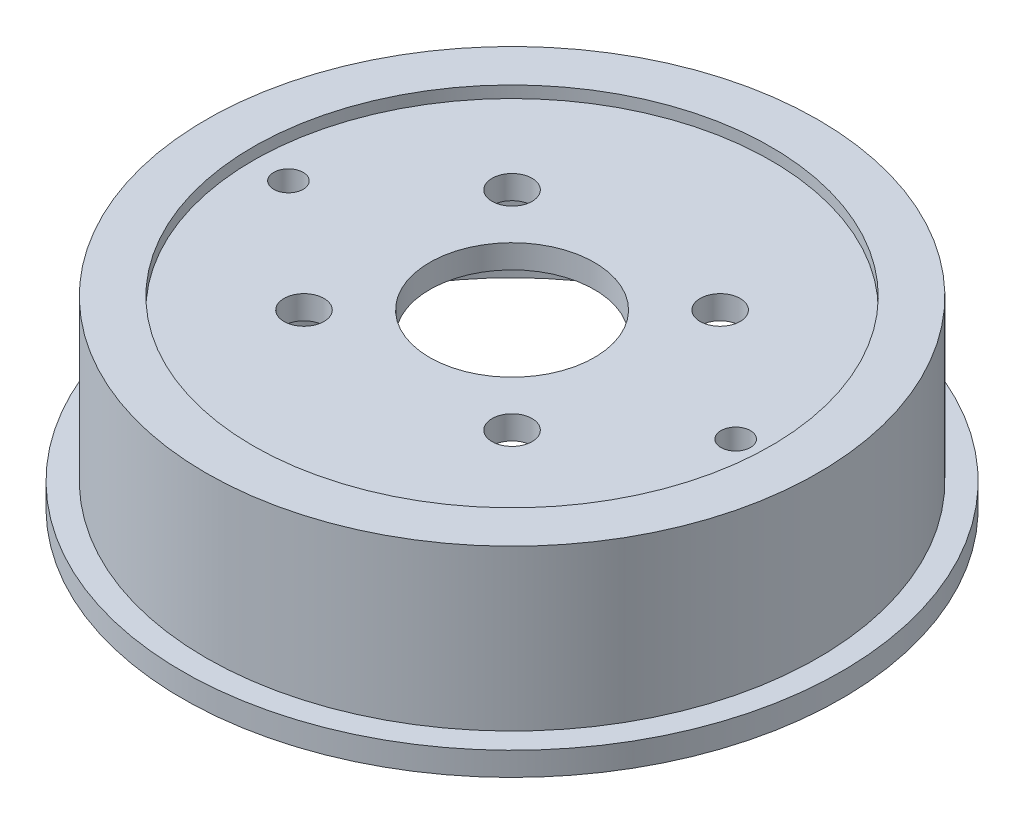
ISO-10303-21;
HEADER;
FILE_DESCRIPTION(('STEP AP214'),'2;1');
FILE_NAME('part.step','',(''),(''),'','','');
FILE_SCHEMA(('AUTOMOTIVE_DESIGN { 1 0 10303 214 1 1 1 1 }'));
ENDSEC;
DATA;
#1=APPLICATION_CONTEXT('core data for automotive mechanical design processes');
#2=APPLICATION_PROTOCOL_DEFINITION('international standard','automotive_design',2000,#1);
#3=PRODUCT_CONTEXT('',#1,'mechanical');
#4=PRODUCT('Part','Part','',(#3));
#5=PRODUCT_RELATED_PRODUCT_CATEGORY('part','',(#4));
#6=PRODUCT_DEFINITION_FORMATION('','',#4);
#7=PRODUCT_DEFINITION_CONTEXT('part definition',#1,'design');
#8=PRODUCT_DEFINITION('design','',#6,#7);
#9=PRODUCT_DEFINITION_SHAPE('','',#8);
#10=(LENGTH_UNIT() NAMED_UNIT(*) SI_UNIT(.MILLI.,.METRE.));
#11=(NAMED_UNIT(*) PLANE_ANGLE_UNIT() SI_UNIT($,.RADIAN.));
#12=(NAMED_UNIT(*) SI_UNIT($,.STERADIAN.) SOLID_ANGLE_UNIT());
#13=UNCERTAINTY_MEASURE_WITH_UNIT(LENGTH_MEASURE(1.E-05),#10,'distance_accuracy_value','');
#14=(GEOMETRIC_REPRESENTATION_CONTEXT(3) GLOBAL_UNCERTAINTY_ASSIGNED_CONTEXT((#13)) GLOBAL_UNIT_ASSIGNED_CONTEXT((#10,
#11,#12)) REPRESENTATION_CONTEXT('',''));
#15=CARTESIAN_POINT('',(0.,0.,0.));
#16=DIRECTION('',(0.,0.,1.));
#17=DIRECTION('',(1.,0.,0.));
#18=AXIS2_PLACEMENT_3D('',#15,#16,#17);
#19=CARTESIAN_POINT('',(0.,12.6,0.));
#20=DIRECTION('',(0.,-1.,0.));
#21=DIRECTION('',(0.,0.,-1.));
#22=AXIS2_PLACEMENT_3D('',#19,#20,#21);
#23=CYLINDRICAL_SURFACE('',#22,24.);
#24=CARTESIAN_POINT('',(0.,0.,0.));
#25=DIRECTION('',(0.,1.,0.));
#26=DIRECTION('',(0.,0.,1.));
#27=AXIS2_PLACEMENT_3D('',#24,#25,#26);
#28=CIRCLE('',#27,24.);
#29=CARTESIAN_POINT('',(0.,0.,24.));
#30=VERTEX_POINT('',#29);
#31=EDGE_CURVE('E173',#30,#30,#28,.T.);
#32=ORIENTED_EDGE('',*,*,#31,.F.);
#33=EDGE_LOOP('',(#32));
#34=FACE_BOUND('',#33,.T.);
#35=CARTESIAN_POINT('',(0.,1.6,0.));
#36=DIRECTION('',(0.,-1.,0.));
#37=DIRECTION('',(0.,0.,-1.));
#38=AXIS2_PLACEMENT_3D('',#35,#36,#37);
#39=CIRCLE('',#38,24.);
#40=CARTESIAN_POINT('',(23.7434201411675,1.6,-3.5));
#41=VERTEX_POINT('',#40);
#42=CARTESIAN_POINT('',(23.7434201411675,1.6,3.5));
#43=VERTEX_POINT('',#42);
#44=EDGE_CURVE('E58',#41,#43,#39,.T.);
#45=ORIENTED_EDGE('',*,*,#44,.F.);
#46=DIRECTION('',(0.,1.,0.));
#47=VECTOR('',#46,1.);
#48=CARTESIAN_POINT('',(23.7434201411675,1.6,-3.5));
#49=LINE('',#48,#47);
#50=CARTESIAN_POINT('',(23.7434201411675,12.6,-3.5));
#51=VERTEX_POINT('',#50);
#52=EDGE_CURVE('E110',#41,#51,#49,.T.);
#53=ORIENTED_EDGE('',*,*,#52,.T.);
#54=CARTESIAN_POINT('',(0.,12.6,0.));
#55=DIRECTION('',(0.,1.,0.));
#56=DIRECTION('',(0.,0.,1.));
#57=AXIS2_PLACEMENT_3D('',#54,#55,#56);
#58=CIRCLE('',#57,24.);
#59=CARTESIAN_POINT('',(-23.7434201411675,12.6,-3.50000000000001));
#60=VERTEX_POINT('',#59);
#61=EDGE_CURVE('E166',#51,#60,#58,.T.);
#62=ORIENTED_EDGE('',*,*,#61,.T.);
#63=DIRECTION('',(0.,1.,0.));
#64=VECTOR('',#63,1.);
#65=CARTESIAN_POINT('',(-23.7434201411675,1.6,-3.5));
#66=LINE('',#65,#64);
#67=CARTESIAN_POINT('',(-23.7434201411675,1.6,-3.5));
#68=VERTEX_POINT('',#67);
#69=EDGE_CURVE('E152',#68,#60,#66,.T.);
#70=ORIENTED_EDGE('',*,*,#69,.F.);
#71=CARTESIAN_POINT('',(0.,1.6,0.));
#72=DIRECTION('',(0.,-1.,0.));
#73=DIRECTION('',(0.,0.,1.));
#74=AXIS2_PLACEMENT_3D('',#71,#72,#73);
#75=CIRCLE('',#74,24.);
#76=CARTESIAN_POINT('',(-23.7434201411675,1.6,3.5));
#77=VERTEX_POINT('',#76);
#78=EDGE_CURVE('E140',#77,#68,#75,.T.);
#79=ORIENTED_EDGE('',*,*,#78,.F.);
#80=DIRECTION('',(0.,1.,0.));
#81=VECTOR('',#80,1.);
#82=CARTESIAN_POINT('',(-23.7434201411675,1.6,3.5));
#83=LINE('',#82,#81);
#84=CARTESIAN_POINT('',(-23.7434201411675,12.6,3.5));
#85=VERTEX_POINT('',#84);
#86=EDGE_CURVE('E155',#77,#85,#83,.T.);
#87=ORIENTED_EDGE('',*,*,#86,.T.);
#88=CARTESIAN_POINT('',(23.7434201411675,12.6,3.50000000000001));
#89=VERTEX_POINT('',#88);
#90=EDGE_CURVE('E167',#85,#89,#58,.T.);
#91=ORIENTED_EDGE('',*,*,#90,.T.);
#92=DIRECTION('',(0.,1.,0.));
#93=VECTOR('',#92,1.);
#94=CARTESIAN_POINT('',(23.7434201411675,1.6,3.5));
#95=LINE('',#94,#93);
#96=EDGE_CURVE('E54',#43,#89,#95,.T.);
#97=ORIENTED_EDGE('',*,*,#96,.F.);
#98=EDGE_LOOP('',(#45,#53,#62,#70,#79,#87,#91,#97));
#99=FACE_BOUND('',#98,.T.);
#100=ADVANCED_FACE('F39',(#34,#99),#23,.F.);
#101=CARTESIAN_POINT('',(0.,12.6,0.));
#102=DIRECTION('',(0.,1.,0.));
#103=DIRECTION('',(0.,0.,1.));
#104=AXIS2_PLACEMENT_3D('',#101,#102,#103);
#105=PLANE('',#104);
#106=CARTESIAN_POINT('',(-8.83883476483184,12.6,-8.83883476483184));
#107=DIRECTION('',(0.,1.,0.));
#108=DIRECTION('',(0.,0.,1.));
#109=AXIS2_PLACEMENT_3D('',#106,#107,#108);
#110=CIRCLE('',#109,1.69999999999999);
#111=CARTESIAN_POINT('',(-8.83883476483184,12.6,-7.13883476483185));
#112=VERTEX_POINT('',#111);
#113=EDGE_CURVE('E412',#112,#112,#110,.T.);
#114=ORIENTED_EDGE('',*,*,#113,.T.);
#115=EDGE_LOOP('',(#114));
#116=FACE_BOUND('',#115,.T.);
#117=CARTESIAN_POINT('',(8.83883476483184,12.6,-8.83883476483184));
#118=DIRECTION('',(0.,1.,0.));
#119=DIRECTION('',(0.,0.,1.));
#120=AXIS2_PLACEMENT_3D('',#117,#118,#119);
#121=CIRCLE('',#120,1.69999999999999);
#122=CARTESIAN_POINT('',(8.83883476483184,12.6,-7.13883476483185));
#123=VERTEX_POINT('',#122);
#124=EDGE_CURVE('E406',#123,#123,#121,.T.);
#125=ORIENTED_EDGE('',*,*,#124,.T.);
#126=EDGE_LOOP('',(#125));
#127=FACE_BOUND('',#126,.T.);
#128=CARTESIAN_POINT('',(8.83883476483185,12.6,8.83883476483184));
#129=DIRECTION('',(0.,1.,0.));
#130=DIRECTION('',(0.,0.,1.));
#131=AXIS2_PLACEMENT_3D('',#128,#129,#130);
#132=CIRCLE('',#131,1.69999999999999);
#133=CARTESIAN_POINT('',(8.83883476483185,12.6,10.5388347648318));
#134=VERTEX_POINT('',#133);
#135=EDGE_CURVE('E400',#134,#134,#132,.T.);
#136=ORIENTED_EDGE('',*,*,#135,.T.);
#137=EDGE_LOOP('',(#136));
#138=FACE_BOUND('',#137,.T.);
#139=CARTESIAN_POINT('',(-8.83883476483184,12.6,8.83883476483184));
#140=DIRECTION('',(0.,1.,0.));
#141=DIRECTION('',(0.,0.,1.));
#142=AXIS2_PLACEMENT_3D('',#139,#140,#141);
#143=CIRCLE('',#142,1.69999999999999);
#144=CARTESIAN_POINT('',(-8.83883476483184,12.6,10.5388347648318));
#145=VERTEX_POINT('',#144);
#146=EDGE_CURVE('E394',#145,#145,#143,.T.);
#147=ORIENTED_EDGE('',*,*,#146,.T.);
#148=EDGE_LOOP('',(#147));
#149=FACE_BOUND('',#148,.T.);
#150=CARTESIAN_POINT('',(0.,12.6,0.));
#151=DIRECTION('',(0.,1.,0.));
#152=DIRECTION('',(0.,0.,1.));
#153=AXIS2_PLACEMENT_3D('',#150,#151,#152);
#154=CIRCLE('',#153,7.);
#155=CARTESIAN_POINT('',(0.,12.6,7.));
#156=VERTEX_POINT('',#155);
#157=EDGE_CURVE('E388',#156,#156,#154,.F.);
#158=ORIENTED_EDGE('',*,*,#157,.F.);
#159=EDGE_LOOP('',(#158));
#160=FACE_BOUND('',#159,.T.);
#161=DIRECTION('',(1.,0.,0.));
#162=VECTOR('',#161,1.);
#163=CARTESIAN_POINT('',(19.,12.6,-3.5));
#164=LINE('',#163,#162);
#165=CARTESIAN_POINT('',(19.,12.6,-3.5));
#166=VERTEX_POINT('',#165);
#167=EDGE_CURVE('E371',#166,#51,#164,.T.);
#168=ORIENTED_EDGE('',*,*,#167,.F.);
#169=CARTESIAN_POINT('',(19.,12.6,0.));
#170=DIRECTION('',(0.,-1.,0.));
#171=DIRECTION('',(0.,0.,-1.));
#172=AXIS2_PLACEMENT_3D('',#169,#170,#171);
#173=CIRCLE('',#172,3.5);
#174=CARTESIAN_POINT('',(19.,12.6,3.5));
#175=VERTEX_POINT('',#174);
#176=EDGE_CURVE('E124',#175,#166,#173,.T.);
#177=ORIENTED_EDGE('',*,*,#176,.F.);
#178=DIRECTION('',(-1.,0.,0.));
#179=VECTOR('',#178,1.);
#180=CARTESIAN_POINT('',(19.,12.6,3.5));
#181=LINE('',#180,#179);
#182=EDGE_CURVE('E121',#89,#175,#181,.T.);
#183=ORIENTED_EDGE('',*,*,#182,.F.);
#184=ORIENTED_EDGE('',*,*,#90,.F.);
#185=DIRECTION('',(-1.,0.,0.));
#186=VECTOR('',#185,1.);
#187=CARTESIAN_POINT('',(-19.,12.6,3.5));
#188=LINE('',#187,#186);
#189=CARTESIAN_POINT('',(-19.,12.6,3.5));
#190=VERTEX_POINT('',#189);
#191=EDGE_CURVE('E128',#190,#85,#188,.T.);
#192=ORIENTED_EDGE('',*,*,#191,.F.);
#193=CARTESIAN_POINT('',(-19.,12.6,0.));
#194=DIRECTION('',(0.,-1.,0.));
#195=DIRECTION('',(0.,0.,1.));
#196=AXIS2_PLACEMENT_3D('',#193,#194,#195);
#197=CIRCLE('',#196,3.5);
#198=CARTESIAN_POINT('',(-19.,12.6,-3.5));
#199=VERTEX_POINT('',#198);
#200=EDGE_CURVE('E125',#199,#190,#197,.T.);
#201=ORIENTED_EDGE('',*,*,#200,.F.);
#202=DIRECTION('',(1.,0.,0.));
#203=VECTOR('',#202,1.);
#204=CARTESIAN_POINT('',(-19.,12.6,-3.5));
#205=LINE('',#204,#203);
#206=EDGE_CURVE('E137',#60,#199,#205,.T.);
#207=ORIENTED_EDGE('',*,*,#206,.F.);
#208=ORIENTED_EDGE('',*,*,#61,.F.);
#209=EDGE_LOOP('',(#168,#177,#183,#184,#192,#201,#207,#208));
#210=FACE_BOUND('',#209,.T.);
#211=ADVANCED_FACE('F186',(#116,#127,#138,#149,#160,#210),#105,.F.);
#212=CARTESIAN_POINT('',(0.,12.6,0.));
#213=DIRECTION('',(0.,-1.,0.));
#214=DIRECTION('',(0.,0.,-1.));
#215=AXIS2_PLACEMENT_3D('',#212,#213,#214);
#216=CYLINDRICAL_SURFACE('',#215,26.);
#217=CARTESIAN_POINT('',(0.,2.,0.));
#218=DIRECTION('',(0.,-1.,0.));
#219=DIRECTION('',(0.,0.,-1.));
#220=AXIS2_PLACEMENT_3D('',#217,#218,#219);
#221=CIRCLE('',#220,26.);
#222=CARTESIAN_POINT('',(0.,2.,-26.));
#223=VERTEX_POINT('',#222);
#224=EDGE_CURVE('E47',#223,#223,#221,.T.);
#225=ORIENTED_EDGE('',*,*,#224,.F.);
#226=EDGE_LOOP('',(#225));
#227=FACE_BOUND('',#226,.T.);
#228=CARTESIAN_POINT('',(0.,15.6,0.));
#229=DIRECTION('',(0.,1.,0.));
#230=DIRECTION('',(0.,0.,1.));
#231=AXIS2_PLACEMENT_3D('',#228,#229,#230);
#232=CIRCLE('',#231,26.);
#233=CARTESIAN_POINT('',(0.,15.6,26.));
#234=VERTEX_POINT('',#233);
#235=EDGE_CURVE('E163',#234,#234,#232,.T.);
#236=ORIENTED_EDGE('',*,*,#235,.F.);
#237=EDGE_LOOP('',(#236));
#238=FACE_BOUND('',#237,.T.);
#239=ADVANCED_FACE('F41',(#227,#238),#216,.T.);
#240=CARTESIAN_POINT('',(0.,0.,0.));
#241=DIRECTION('',(0.,1.,0.));
#242=DIRECTION('',(0.,0.,1.));
#243=AXIS2_PLACEMENT_3D('',#240,#241,#242);
#244=PLANE('',#243);
#245=ORIENTED_EDGE('',*,*,#31,.T.);
#246=EDGE_LOOP('',(#245));
#247=FACE_BOUND('',#246,.T.);
#248=CARTESIAN_POINT('',(0.,0.,0.));
#249=DIRECTION('',(0.,-1.,0.));
#250=DIRECTION('',(0.,0.,-1.));
#251=AXIS2_PLACEMENT_3D('',#248,#249,#250);
#252=CIRCLE('',#251,28.);
#253=CARTESIAN_POINT('',(0.,0.,-28.));
#254=VERTEX_POINT('',#253);
#255=EDGE_CURVE('E169',#254,#254,#252,.T.);
#256=ORIENTED_EDGE('',*,*,#255,.T.);
#257=EDGE_LOOP('',(#256));
#258=FACE_BOUND('',#257,.T.);
#259=ADVANCED_FACE('F185',(#247,#258),#244,.F.);
#260=CARTESIAN_POINT('',(0.,2.,0.));
#261=DIRECTION('',(0.,-1.,0.));
#262=DIRECTION('',(0.,0.,-1.));
#263=AXIS2_PLACEMENT_3D('',#260,#261,#262);
#264=CYLINDRICAL_SURFACE('',#263,28.);
#265=CARTESIAN_POINT('',(0.,2.,0.));
#266=DIRECTION('',(0.,-1.,0.));
#267=DIRECTION('',(0.,0.,-1.));
#268=AXIS2_PLACEMENT_3D('',#265,#266,#267);
#269=CIRCLE('',#268,28.);
#270=CARTESIAN_POINT('',(0.,2.,-28.));
#271=VERTEX_POINT('',#270);
#272=EDGE_CURVE('E170',#271,#271,#269,.T.);
#273=ORIENTED_EDGE('',*,*,#272,.T.);
#274=EDGE_LOOP('',(#273));
#275=FACE_BOUND('',#274,.T.);
#276=ORIENTED_EDGE('',*,*,#255,.F.);
#277=EDGE_LOOP('',(#276));
#278=FACE_BOUND('',#277,.T.);
#279=ADVANCED_FACE('F226',(#275,#278),#264,.T.);
#280=CARTESIAN_POINT('',(0.,2.,0.));
#281=DIRECTION('',(0.,-1.,0.));
#282=DIRECTION('',(0.,0.,-1.));
#283=AXIS2_PLACEMENT_3D('',#280,#281,#282);
#284=PLANE('',#283);
#285=ORIENTED_EDGE('',*,*,#224,.T.);
#286=EDGE_LOOP('',(#285));
#287=FACE_BOUND('',#286,.T.);
#288=ORIENTED_EDGE('',*,*,#272,.F.);
#289=EDGE_LOOP('',(#288));
#290=FACE_BOUND('',#289,.T.);
#291=ADVANCED_FACE('F180',(#287,#290),#284,.F.);
#292=CARTESIAN_POINT('',(0.,15.6,0.));
#293=DIRECTION('',(0.,1.,0.));
#294=DIRECTION('',(0.,0.,1.));
#295=AXIS2_PLACEMENT_3D('',#292,#293,#294);
#296=PLANE('',#295);
#297=ORIENTED_EDGE('',*,*,#235,.T.);
#298=EDGE_LOOP('',(#297));
#299=FACE_BOUND('',#298,.T.);
#300=CARTESIAN_POINT('',(0.,15.6,0.));
#301=DIRECTION('',(0.,1.,0.));
#302=DIRECTION('',(0.,0.,1.));
#303=AXIS2_PLACEMENT_3D('',#300,#301,#302);
#304=CIRCLE('',#303,22.);
#305=CARTESIAN_POINT('',(0.,15.6,22.));
#306=VERTEX_POINT('',#305);
#307=EDGE_CURVE('E160',#306,#306,#304,.T.);
#308=ORIENTED_EDGE('',*,*,#307,.F.);
#309=EDGE_LOOP('',(#308));
#310=FACE_BOUND('',#309,.T.);
#311=ADVANCED_FACE('F189',(#299,#310),#296,.T.);
#312=CARTESIAN_POINT('',(0.,15.6,0.));
#313=DIRECTION('',(0.,-1.,0.));
#314=DIRECTION('',(0.,0.,-1.));
#315=AXIS2_PLACEMENT_3D('',#312,#313,#314);
#316=CYLINDRICAL_SURFACE('',#315,22.);
#317=ORIENTED_EDGE('',*,*,#307,.T.);
#318=EDGE_LOOP('',(#317));
#319=FACE_BOUND('',#318,.T.);
#320=CARTESIAN_POINT('',(0.,14.6,0.));
#321=DIRECTION('',(0.,1.,0.));
#322=DIRECTION('',(0.,0.,1.));
#323=AXIS2_PLACEMENT_3D('',#320,#321,#322);
#324=CIRCLE('',#323,22.);
#325=CARTESIAN_POINT('',(0.,14.6,22.));
#326=VERTEX_POINT('',#325);
#327=EDGE_CURVE('E11',#326,#326,#324,.F.);
#328=ORIENTED_EDGE('',*,*,#327,.T.);
#329=EDGE_LOOP('',(#328));
#330=FACE_BOUND('',#329,.T.);
#331=ADVANCED_FACE('F192',(#319,#330),#316,.F.);
#332=CARTESIAN_POINT('',(0.,14.6,0.));
#333=DIRECTION('',(0.,1.,0.));
#334=DIRECTION('',(0.,0.,1.));
#335=AXIS2_PLACEMENT_3D('',#332,#333,#334);
#336=PLANE('',#335);
#337=CARTESIAN_POINT('',(-8.83883476483184,14.6,-8.83883476483184));
#338=DIRECTION('',(0.,1.,0.));
#339=DIRECTION('',(0.,0.,1.));
#340=AXIS2_PLACEMENT_3D('',#337,#338,#339);
#341=CIRCLE('',#340,1.69999999999999);
#342=CARTESIAN_POINT('',(-8.83883476483184,14.6,-7.13883476483185));
#343=VERTEX_POINT('',#342);
#344=EDGE_CURVE('E415',#343,#343,#341,.T.);
#345=ORIENTED_EDGE('',*,*,#344,.F.);
#346=EDGE_LOOP('',(#345));
#347=FACE_BOUND('',#346,.T.);
#348=CARTESIAN_POINT('',(8.83883476483184,14.6,-8.83883476483184));
#349=DIRECTION('',(0.,1.,0.));
#350=DIRECTION('',(0.,0.,1.));
#351=AXIS2_PLACEMENT_3D('',#348,#349,#350);
#352=CIRCLE('',#351,1.69999999999999);
#353=CARTESIAN_POINT('',(8.83883476483184,14.6,-7.13883476483186));
#354=VERTEX_POINT('',#353);
#355=EDGE_CURVE('E409',#354,#354,#352,.T.);
#356=ORIENTED_EDGE('',*,*,#355,.F.);
#357=EDGE_LOOP('',(#356));
#358=FACE_BOUND('',#357,.T.);
#359=CARTESIAN_POINT('',(8.83883476483185,14.6,8.83883476483184));
#360=DIRECTION('',(0.,1.,0.));
#361=DIRECTION('',(0.,0.,1.));
#362=AXIS2_PLACEMENT_3D('',#359,#360,#361);
#363=CIRCLE('',#362,1.69999999999999);
#364=CARTESIAN_POINT('',(8.83883476483185,14.6,10.5388347648318));
#365=VERTEX_POINT('',#364);
#366=EDGE_CURVE('E403',#365,#365,#363,.T.);
#367=ORIENTED_EDGE('',*,*,#366,.F.);
#368=EDGE_LOOP('',(#367));
#369=FACE_BOUND('',#368,.T.);
#370=CARTESIAN_POINT('',(-8.83883476483184,14.6,8.83883476483184));
#371=DIRECTION('',(0.,1.,0.));
#372=DIRECTION('',(0.,0.,1.));
#373=AXIS2_PLACEMENT_3D('',#370,#371,#372);
#374=CIRCLE('',#373,1.69999999999999);
#375=CARTESIAN_POINT('',(-8.83883476483184,14.6,10.5388347648318));
#376=VERTEX_POINT('',#375);
#377=EDGE_CURVE('E397',#376,#376,#374,.T.);
#378=ORIENTED_EDGE('',*,*,#377,.F.);
#379=EDGE_LOOP('',(#378));
#380=FACE_BOUND('',#379,.T.);
#381=CARTESIAN_POINT('',(0.,14.6,0.));
#382=DIRECTION('',(0.,1.,0.));
#383=DIRECTION('',(0.,0.,1.));
#384=AXIS2_PLACEMENT_3D('',#381,#382,#383);
#385=CIRCLE('',#384,7.);
#386=CARTESIAN_POINT('',(0.,14.6,7.));
#387=VERTEX_POINT('',#386);
#388=EDGE_CURVE('E391',#387,#387,#385,.T.);
#389=ORIENTED_EDGE('',*,*,#388,.F.);
#390=EDGE_LOOP('',(#389));
#391=FACE_BOUND('',#390,.T.);
#392=CARTESIAN_POINT('',(19.,14.6,0.));
#393=DIRECTION('',(0.,1.,0.));
#394=DIRECTION('',(0.,0.,1.));
#395=AXIS2_PLACEMENT_3D('',#392,#393,#394);
#396=CIRCLE('',#395,1.24999999999999);
#397=CARTESIAN_POINT('',(19.,14.6,1.24999999999999));
#398=VERTEX_POINT('',#397);
#399=EDGE_CURVE('E382',#398,#398,#396,.T.);
#400=ORIENTED_EDGE('',*,*,#399,.F.);
#401=EDGE_LOOP('',(#400));
#402=FACE_BOUND('',#401,.T.);
#403=CARTESIAN_POINT('',(-19.,14.6,0.));
#404=DIRECTION('',(0.,1.,0.));
#405=DIRECTION('',(0.,0.,1.));
#406=AXIS2_PLACEMENT_3D('',#403,#404,#405);
#407=CIRCLE('',#406,1.24999999999999);
#408=CARTESIAN_POINT('',(-19.,14.6,1.24999999999999));
#409=VERTEX_POINT('',#408);
#410=EDGE_CURVE('E374',#409,#409,#407,.T.);
#411=ORIENTED_EDGE('',*,*,#410,.F.);
#412=EDGE_LOOP('',(#411));
#413=FACE_BOUND('',#412,.T.);
#414=ORIENTED_EDGE('',*,*,#327,.F.);
#415=EDGE_LOOP('',(#414));
#416=FACE_BOUND('',#415,.T.);
#417=ADVANCED_FACE('F198',(#347,#358,#369,#380,#391,#402,#413,#416),#336,.T.);
#418=CARTESIAN_POINT('',(-19.,1.6,0.));
#419=DIRECTION('',(0.,1.,0.));
#420=DIRECTION('',(0.,0.,1.));
#421=AXIS2_PLACEMENT_3D('',#418,#419,#420);
#422=CYLINDRICAL_SURFACE('',#421,3.5);
#423=ORIENTED_EDGE('',*,*,#200,.T.);
#424=DIRECTION('',(0.,1.,0.));
#425=VECTOR('',#424,1.);
#426=CARTESIAN_POINT('',(-19.,1.6,3.5));
#427=LINE('',#426,#425);
#428=CARTESIAN_POINT('',(-19.,1.6,3.5));
#429=VERTEX_POINT('',#428);
#430=EDGE_CURVE('E157',#429,#190,#427,.T.);
#431=ORIENTED_EDGE('',*,*,#430,.F.);
#432=CARTESIAN_POINT('',(-19.,1.6,0.));
#433=DIRECTION('',(0.,-1.,0.));
#434=DIRECTION('',(0.,0.,1.));
#435=AXIS2_PLACEMENT_3D('',#432,#433,#434);
#436=CIRCLE('',#435,3.5);
#437=CARTESIAN_POINT('',(-19.,1.6,-3.5));
#438=VERTEX_POINT('',#437);
#439=EDGE_CURVE('E133',#438,#429,#436,.T.);
#440=ORIENTED_EDGE('',*,*,#439,.F.);
#441=DIRECTION('',(0.,1.,0.));
#442=VECTOR('',#441,1.);
#443=CARTESIAN_POINT('',(-19.,1.6,-3.5));
#444=LINE('',#443,#442);
#445=EDGE_CURVE('E144',#438,#199,#444,.T.);
#446=ORIENTED_EDGE('',*,*,#445,.T.);
#447=EDGE_LOOP('',(#423,#431,#440,#446));
#448=FACE_BOUND('',#447,.T.);
#449=ADVANCED_FACE('F203',(#448),#422,.T.);
#450=CARTESIAN_POINT('',(-19.,1.6,3.5));
#451=DIRECTION('',(0.,0.,-1.));
#452=DIRECTION('',(-1.,0.,0.));
#453=AXIS2_PLACEMENT_3D('',#450,#451,#452);
#454=PLANE('',#453);
#455=ORIENTED_EDGE('',*,*,#191,.T.);
#456=ORIENTED_EDGE('',*,*,#86,.F.);
#457=DIRECTION('',(-1.,0.,0.));
#458=VECTOR('',#457,1.);
#459=CARTESIAN_POINT('',(-19.,1.6,3.5));
#460=LINE('',#459,#458);
#461=EDGE_CURVE('E136',#429,#77,#460,.T.);
#462=ORIENTED_EDGE('',*,*,#461,.F.);
#463=ORIENTED_EDGE('',*,*,#430,.T.);
#464=EDGE_LOOP('',(#455,#456,#462,#463));
#465=FACE_BOUND('',#464,.T.);
#466=ADVANCED_FACE('F209',(#465),#454,.F.);
#467=CARTESIAN_POINT('',(-19.,1.6,-3.5));
#468=DIRECTION('',(0.,0.,1.));
#469=DIRECTION('',(1.,0.,0.));
#470=AXIS2_PLACEMENT_3D('',#467,#468,#469);
#471=PLANE('',#470);
#472=ORIENTED_EDGE('',*,*,#206,.T.);
#473=ORIENTED_EDGE('',*,*,#445,.F.);
#474=DIRECTION('',(1.,0.,0.));
#475=VECTOR('',#474,1.);
#476=CARTESIAN_POINT('',(-19.,1.6,-3.5));
#477=LINE('',#476,#475);
#478=EDGE_CURVE('E143',#68,#438,#477,.T.);
#479=ORIENTED_EDGE('',*,*,#478,.F.);
#480=ORIENTED_EDGE('',*,*,#69,.T.);
#481=EDGE_LOOP('',(#472,#473,#479,#480));
#482=FACE_BOUND('',#481,.T.);
#483=ADVANCED_FACE('F352',(#482),#471,.F.);
#484=CARTESIAN_POINT('',(-19.,1.6,0.));
#485=DIRECTION('',(0.,1.,0.));
#486=DIRECTION('',(0.,0.,1.));
#487=AXIS2_PLACEMENT_3D('',#484,#485,#486);
#488=PLANE('',#487);
#489=CARTESIAN_POINT('',(-19.,1.6,0.));
#490=DIRECTION('',(0.,-1.,0.));
#491=DIRECTION('',(0.,0.,-1.));
#492=AXIS2_PLACEMENT_3D('',#489,#490,#491);
#493=CIRCLE('',#492,1.24999999999999);
#494=CARTESIAN_POINT('',(-19.,1.6,-1.24999999999999));
#495=VERTEX_POINT('',#494);
#496=EDGE_CURVE('E379',#495,#495,#493,.T.);
#497=ORIENTED_EDGE('',*,*,#496,.F.);
#498=EDGE_LOOP('',(#497));
#499=FACE_BOUND('',#498,.T.);
#500=ORIENTED_EDGE('',*,*,#439,.T.);
#501=ORIENTED_EDGE('',*,*,#461,.T.);
#502=ORIENTED_EDGE('',*,*,#78,.T.);
#503=ORIENTED_EDGE('',*,*,#478,.T.);
#504=EDGE_LOOP('',(#500,#501,#502,#503));
#505=FACE_BOUND('',#504,.T.);
#506=ADVANCED_FACE('F349',(#499,#505),#488,.F.);
#507=CARTESIAN_POINT('',(19.,1.6,0.));
#508=DIRECTION('',(0.,1.,0.));
#509=DIRECTION('',(0.,0.,1.));
#510=AXIS2_PLACEMENT_3D('',#507,#508,#509);
#511=CYLINDRICAL_SURFACE('',#510,3.5);
#512=ORIENTED_EDGE('',*,*,#176,.T.);
#513=DIRECTION('',(0.,1.,0.));
#514=VECTOR('',#513,1.);
#515=CARTESIAN_POINT('',(19.,1.6,-3.5));
#516=LINE('',#515,#514);
#517=CARTESIAN_POINT('',(19.,1.6,-3.5));
#518=VERTEX_POINT('',#517);
#519=EDGE_CURVE('E108',#518,#166,#516,.T.);
#520=ORIENTED_EDGE('',*,*,#519,.F.);
#521=CARTESIAN_POINT('',(19.,1.6,0.));
#522=DIRECTION('',(0.,-1.,0.));
#523=DIRECTION('',(0.,0.,-1.));
#524=AXIS2_PLACEMENT_3D('',#521,#522,#523);
#525=CIRCLE('',#524,3.5);
#526=CARTESIAN_POINT('',(19.,1.6,3.5));
#527=VERTEX_POINT('',#526);
#528=EDGE_CURVE('E112',#527,#518,#525,.T.);
#529=ORIENTED_EDGE('',*,*,#528,.F.);
#530=DIRECTION('',(0.,1.,0.));
#531=VECTOR('',#530,1.);
#532=CARTESIAN_POINT('',(19.,1.6,3.5));
#533=LINE('',#532,#531);
#534=EDGE_CURVE('E367',#527,#175,#533,.T.);
#535=ORIENTED_EDGE('',*,*,#534,.T.);
#536=EDGE_LOOP('',(#512,#520,#529,#535));
#537=FACE_BOUND('',#536,.T.);
#538=ADVANCED_FACE('F123',(#537),#511,.T.);
#539=CARTESIAN_POINT('',(19.,1.6,-3.5));
#540=DIRECTION('',(0.,0.,1.));
#541=DIRECTION('',(1.,0.,0.));
#542=AXIS2_PLACEMENT_3D('',#539,#540,#541);
#543=PLANE('',#542);
#544=ORIENTED_EDGE('',*,*,#167,.T.);
#545=ORIENTED_EDGE('',*,*,#52,.F.);
#546=DIRECTION('',(1.,0.,0.));
#547=VECTOR('',#546,1.);
#548=CARTESIAN_POINT('',(19.,1.6,-3.5));
#549=LINE('',#548,#547);
#550=EDGE_CURVE('E103',#518,#41,#549,.T.);
#551=ORIENTED_EDGE('',*,*,#550,.F.);
#552=ORIENTED_EDGE('',*,*,#519,.T.);
#553=EDGE_LOOP('',(#544,#545,#551,#552));
#554=FACE_BOUND('',#553,.T.);
#555=ADVANCED_FACE('F106',(#554),#543,.F.);
#556=CARTESIAN_POINT('',(19.,1.6,3.5));
#557=DIRECTION('',(0.,0.,-1.));
#558=DIRECTION('',(-1.,0.,0.));
#559=AXIS2_PLACEMENT_3D('',#556,#557,#558);
#560=PLANE('',#559);
#561=ORIENTED_EDGE('',*,*,#182,.T.);
#562=ORIENTED_EDGE('',*,*,#534,.F.);
#563=DIRECTION('',(-1.,0.,0.));
#564=VECTOR('',#563,1.);
#565=CARTESIAN_POINT('',(19.,1.6,3.5));
#566=LINE('',#565,#564);
#567=EDGE_CURVE('E117',#43,#527,#566,.T.);
#568=ORIENTED_EDGE('',*,*,#567,.F.);
#569=ORIENTED_EDGE('',*,*,#96,.T.);
#570=EDGE_LOOP('',(#561,#562,#568,#569));
#571=FACE_BOUND('',#570,.T.);
#572=ADVANCED_FACE('F340',(#571),#560,.F.);
#573=CARTESIAN_POINT('',(19.,1.6,0.));
#574=DIRECTION('',(0.,-1.,0.));
#575=DIRECTION('',(0.,0.,-1.));
#576=AXIS2_PLACEMENT_3D('',#573,#574,#575);
#577=PLANE('',#576);
#578=CARTESIAN_POINT('',(19.,1.6,0.));
#579=DIRECTION('',(0.,-1.,0.));
#580=DIRECTION('',(0.,0.,-1.));
#581=AXIS2_PLACEMENT_3D('',#578,#579,#580);
#582=CIRCLE('',#581,1.24999999999999);
#583=CARTESIAN_POINT('',(19.,1.6,-1.24999999999999));
#584=VERTEX_POINT('',#583);
#585=EDGE_CURVE('E385',#584,#584,#582,.T.);
#586=ORIENTED_EDGE('',*,*,#585,.F.);
#587=EDGE_LOOP('',(#586));
#588=FACE_BOUND('',#587,.T.);
#589=ORIENTED_EDGE('',*,*,#528,.T.);
#590=ORIENTED_EDGE('',*,*,#550,.T.);
#591=ORIENTED_EDGE('',*,*,#44,.T.);
#592=ORIENTED_EDGE('',*,*,#567,.T.);
#593=EDGE_LOOP('',(#589,#590,#591,#592));
#594=FACE_BOUND('',#593,.T.);
#595=ADVANCED_FACE('F115',(#588,#594),#577,.T.);
#596=CARTESIAN_POINT('',(-19.,1.6,0.));
#597=DIRECTION('',(0.,-1.,0.));
#598=DIRECTION('',(0.,0.,-1.));
#599=AXIS2_PLACEMENT_3D('',#596,#597,#598);
#600=CYLINDRICAL_SURFACE('',#599,1.24999999999999);
#601=ORIENTED_EDGE('',*,*,#410,.T.);
#602=EDGE_LOOP('',(#601));
#603=FACE_BOUND('',#602,.T.);
#604=ORIENTED_EDGE('',*,*,#496,.T.);
#605=EDGE_LOOP('',(#604));
#606=FACE_BOUND('',#605,.T.);
#607=ADVANCED_FACE('F333',(#603,#606),#600,.F.);
#608=CARTESIAN_POINT('',(19.,1.6,0.));
#609=DIRECTION('',(0.,-1.,0.));
#610=DIRECTION('',(0.,0.,-1.));
#611=AXIS2_PLACEMENT_3D('',#608,#609,#610);
#612=CYLINDRICAL_SURFACE('',#611,1.24999999999999);
#613=ORIENTED_EDGE('',*,*,#399,.T.);
#614=EDGE_LOOP('',(#613));
#615=FACE_BOUND('',#614,.T.);
#616=ORIENTED_EDGE('',*,*,#585,.T.);
#617=EDGE_LOOP('',(#616));
#618=FACE_BOUND('',#617,.T.);
#619=ADVANCED_FACE('F329',(#615,#618),#612,.F.);
#620=CARTESIAN_POINT('',(0.,-0.000999999999999265,0.));
#621=DIRECTION('',(0.,1.,0.));
#622=DIRECTION('',(0.,0.,1.));
#623=AXIS2_PLACEMENT_3D('',#620,#621,#622);
#624=CYLINDRICAL_SURFACE('',#623,7.);
#625=ORIENTED_EDGE('',*,*,#388,.T.);
#626=EDGE_LOOP('',(#625));
#627=FACE_BOUND('',#626,.T.);
#628=ORIENTED_EDGE('',*,*,#157,.T.);
#629=EDGE_LOOP('',(#628));
#630=FACE_BOUND('',#629,.T.);
#631=ADVANCED_FACE('F289',(#627,#630),#624,.F.);
#632=CARTESIAN_POINT('',(-8.83883476483184,14.6,8.83883476483184));
#633=DIRECTION('',(0.,1.,0.));
#634=DIRECTION('',(0.,0.,1.));
#635=AXIS2_PLACEMENT_3D('',#632,#633,#634);
#636=CYLINDRICAL_SURFACE('',#635,1.69999999999999);
#637=ORIENTED_EDGE('',*,*,#146,.F.);
#638=EDGE_LOOP('',(#637));
#639=FACE_BOUND('',#638,.T.);
#640=ORIENTED_EDGE('',*,*,#377,.T.);
#641=EDGE_LOOP('',(#640));
#642=FACE_BOUND('',#641,.T.);
#643=ADVANCED_FACE('F283',(#639,#642),#636,.F.);
#644=CARTESIAN_POINT('',(8.83883476483185,14.6,8.83883476483184));
#645=DIRECTION('',(0.,1.,0.));
#646=DIRECTION('',(0.,0.,1.));
#647=AXIS2_PLACEMENT_3D('',#644,#645,#646);
#648=CYLINDRICAL_SURFACE('',#647,1.69999999999999);
#649=ORIENTED_EDGE('',*,*,#135,.F.);
#650=EDGE_LOOP('',(#649));
#651=FACE_BOUND('',#650,.T.);
#652=ORIENTED_EDGE('',*,*,#366,.T.);
#653=EDGE_LOOP('',(#652));
#654=FACE_BOUND('',#653,.T.);
#655=ADVANCED_FACE('F288',(#651,#654),#648,.F.);
#656=CARTESIAN_POINT('',(8.83883476483184,14.6,-8.83883476483184));
#657=DIRECTION('',(0.,1.,0.));
#658=DIRECTION('',(0.,0.,1.));
#659=AXIS2_PLACEMENT_3D('',#656,#657,#658);
#660=CYLINDRICAL_SURFACE('',#659,1.69999999999999);
#661=ORIENTED_EDGE('',*,*,#124,.F.);
#662=EDGE_LOOP('',(#661));
#663=FACE_BOUND('',#662,.T.);
#664=ORIENTED_EDGE('',*,*,#355,.T.);
#665=EDGE_LOOP('',(#664));
#666=FACE_BOUND('',#665,.T.);
#667=ADVANCED_FACE('F301',(#663,#666),#660,.F.);
#668=CARTESIAN_POINT('',(-8.83883476483184,14.6,-8.83883476483184));
#669=DIRECTION('',(0.,1.,0.));
#670=DIRECTION('',(0.,0.,1.));
#671=AXIS2_PLACEMENT_3D('',#668,#669,#670);
#672=CYLINDRICAL_SURFACE('',#671,1.69999999999999);
#673=ORIENTED_EDGE('',*,*,#113,.F.);
#674=EDGE_LOOP('',(#673));
#675=FACE_BOUND('',#674,.T.);
#676=ORIENTED_EDGE('',*,*,#344,.T.);
#677=EDGE_LOOP('',(#676));
#678=FACE_BOUND('',#677,.T.);
#679=ADVANCED_FACE('F311',(#675,#678),#672,.F.);
#680=CLOSED_SHELL('',(#100,#211,#239,#259,#279,#291,#311,#331,#417,#449,#466,#483,#506,#538,
#555,#572,#595,#607,#619,#631,#643,#655,#667,#679));
#681=MANIFOLD_SOLID_BREP('B2',#680);
#682=ADVANCED_BREP_SHAPE_REPRESENTATION('',(#18,#681),#14);
#683=SHAPE_DEFINITION_REPRESENTATION(#9,#682);
ENDSEC;
END-ISO-10303-21;
